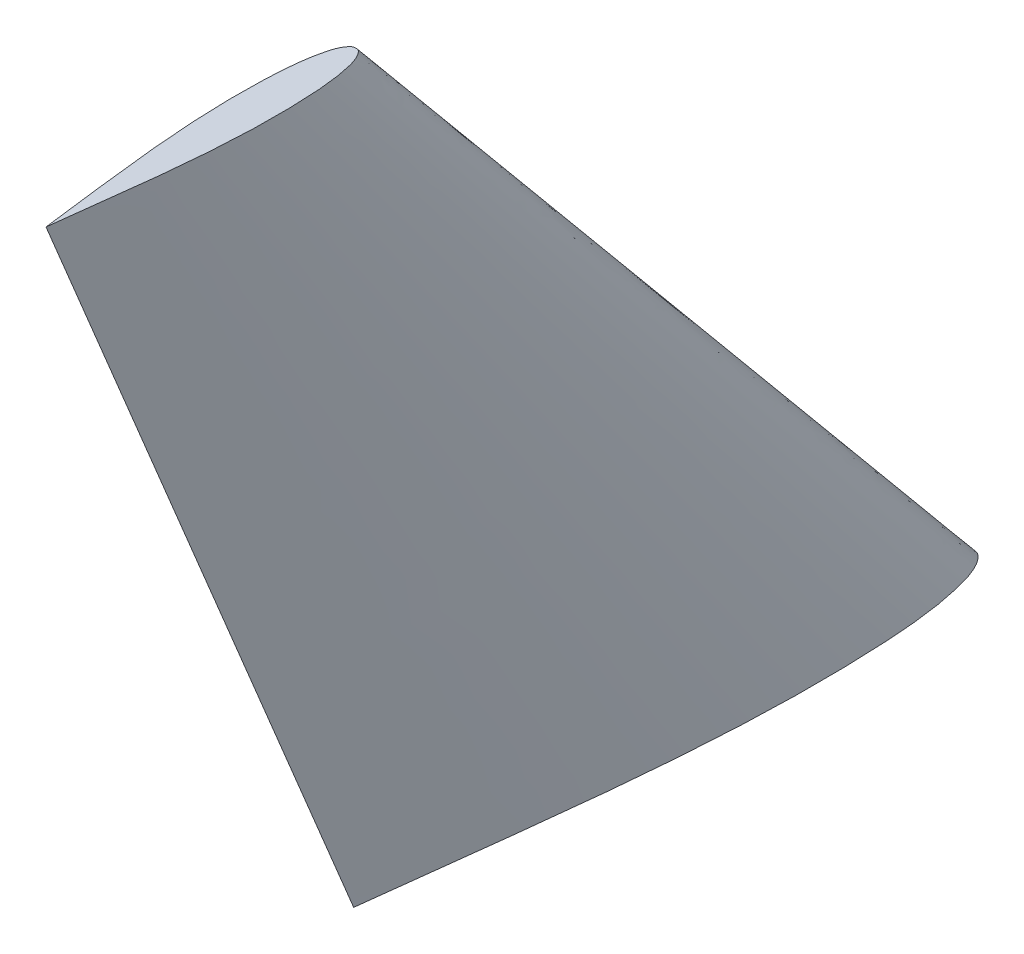
ISO-10303-21;
HEADER;
FILE_DESCRIPTION(('STEP AP214'),'2;1');
FILE_NAME('part.step','',(''),(''),'','','');
FILE_SCHEMA(('AUTOMOTIVE_DESIGN { 1 0 10303 214 1 1 1 1 }'));
ENDSEC;
DATA;
#1=APPLICATION_CONTEXT('core data for automotive mechanical design processes');
#2=APPLICATION_PROTOCOL_DEFINITION('international standard','automotive_design',2000,#1);
#3=PRODUCT_CONTEXT('',#1,'mechanical');
#4=PRODUCT('Part','Part','',(#3));
#5=PRODUCT_RELATED_PRODUCT_CATEGORY('part','',(#4));
#6=PRODUCT_DEFINITION_FORMATION('','',#4);
#7=PRODUCT_DEFINITION_CONTEXT('part definition',#1,'design');
#8=PRODUCT_DEFINITION('design','',#6,#7);
#9=PRODUCT_DEFINITION_SHAPE('','',#8);
#10=(LENGTH_UNIT() NAMED_UNIT(*) SI_UNIT(.MILLI.,.METRE.));
#11=(NAMED_UNIT(*) PLANE_ANGLE_UNIT() SI_UNIT($,.RADIAN.));
#12=(NAMED_UNIT(*) SI_UNIT($,.STERADIAN.) SOLID_ANGLE_UNIT());
#13=UNCERTAINTY_MEASURE_WITH_UNIT(LENGTH_MEASURE(1.E-05),#10,'distance_accuracy_value','');
#14=(GEOMETRIC_REPRESENTATION_CONTEXT(3) GLOBAL_UNCERTAINTY_ASSIGNED_CONTEXT((#13)) GLOBAL_UNIT_ASSIGNED_CONTEXT((#10,
#11,#12)) REPRESENTATION_CONTEXT('',''));
#15=CARTESIAN_POINT('',(0.,0.,0.));
#16=DIRECTION('',(0.,0.,1.));
#17=DIRECTION('',(1.,0.,0.));
#18=AXIS2_PLACEMENT_3D('',#15,#16,#17);
#19=CARTESIAN_POINT('',(-154.159683568684,6696.456,4147.13388304821));
#20=DIRECTION('',(0.,-1.,0.));
#21=DIRECTION('',(0.,0.,-1.));
#22=AXIS2_PLACEMENT_3D('',#19,#20,#21);
#23=PLANE('',#22);
#24=CARTESIAN_POINT('',(0.,6696.456,2772.65353731669));
#25=CARTESIAN_POINT('',(-16.9799177376313,6696.456,2767.14530322179));
#26=CARTESIAN_POINT('',(-40.191091939583,6696.456,2785.80598263826));
#27=CARTESIAN_POINT('',(-82.3452108224661,6696.456,2843.24208974967));
#28=CARTESIAN_POINT('',(-112.463446335225,6696.456,2942.34070083599));
#29=CARTESIAN_POINT('',(-146.975535405465,6696.456,3121.72352900064));
#30=CARTESIAN_POINT('',(-216.027003638885,6696.456,4000.057912964));
#31=CARTESIAN_POINT('',(-88.1786721100751,6696.456,4833.01007460194));
#32=CARTESIAN_POINT('',(0.,6696.456,5562.79517571669));
#33=B_SPLINE_CURVE_WITH_KNOTS('',3,(#24,#25,#26,#27,#28,#29,#30,#31,#32),.UNSPECIFIED.,.F.,.F.,
(4,1,1,1,1,1,4),(0.,0.0164373606134582,0.028569000403652,0.0756971622985249,0.12246031924641,
0.221963948972587,1.),.UNSPECIFIED.);
#34=CARTESIAN_POINT('',(0.,6696.456,2772.65353731669));
#35=VERTEX_POINT('',#34);
#36=CARTESIAN_POINT('',(0.,6696.456,5562.79517571669));
#37=VERTEX_POINT('',#36);
#38=EDGE_CURVE('E56',#35,#37,#33,.T.);
#39=ORIENTED_EDGE('',*,*,#38,.T.);
#40=CARTESIAN_POINT('',(0.,6696.456,5562.79517571669));
#41=CARTESIAN_POINT('',(88.1786721100753,6696.456,4833.01007460193));
#42=CARTESIAN_POINT('',(216.027003638886,6696.456,4000.057912964));
#43=CARTESIAN_POINT('',(146.975535405465,6696.456,3121.72352900064));
#44=CARTESIAN_POINT('',(112.463446335225,6696.456,2942.34070083599));
#45=CARTESIAN_POINT('',(82.345210822466,6696.456,2843.24208974967));
#46=CARTESIAN_POINT('',(40.191091939583,6696.456,2785.80598263826));
#47=CARTESIAN_POINT('',(16.9799177376313,6696.456,2767.14530322179));
#48=CARTESIAN_POINT('',(0.,6696.456,2772.65353731669));
#49=B_SPLINE_CURVE_WITH_KNOTS('',3,(#40,#41,#42,#43,#44,#45,#46,#47,#48),.UNSPECIFIED.,.F.,.F.,
(4,1,1,1,1,1,4),(0.,0.778036051027413,0.87753968075359,0.924302837701475,0.971430999596348,
0.983562639386542,1.),.UNSPECIFIED.);
#50=EDGE_CURVE('E13',#37,#35,#49,.T.);
#51=ORIENTED_EDGE('',*,*,#50,.T.);
#52=EDGE_LOOP('',(#39,#51));
#53=FACE_BOUND('',#52,.T.);
#54=ADVANCED_FACE('F47',(#53),#23,.F.);
#55=CARTESIAN_POINT('',(-304.474221344365,0.,-41.5864506878354));
#56=DIRECTION('',(0.,-1.,0.));
#57=DIRECTION('',(0.,0.,-1.));
#58=AXIS2_PLACEMENT_3D('',#55,#56,#57);
#59=PLANE('',#58);
#60=CARTESIAN_POINT('',(-1.0250816319537E-12,0.,-2790.142248));
#61=CARTESIAN_POINT('',(-32.4305536252133,0.,-2797.70395188873));
#62=CARTESIAN_POINT('',(-84.2145432485902,0.,-2759.26570691292));
#63=CARTESIAN_POINT('',(-160.784275422863,0.,-2647.85891062494));
#64=CARTESIAN_POINT('',(-216.23651145109,0.,-2472.6267179323));
#65=CARTESIAN_POINT('',(-292.945329003994,0.,-2117.62583216752));
#66=CARTESIAN_POINT('',(-431.079514036101,0.,-352.454920959716));
#67=CARTESIAN_POINT('',(-168.446184180462,0.,1327.50774931477));
#68=CARTESIAN_POINT('',(0.,0.,2790.142248));
#69=B_SPLINE_CURVE_WITH_KNOTS('',3,(#60,#61,#62,#63,#64,#65,#66,#67,#68),.UNSPECIFIED.,.F.,.F.,
(4,1,1,1,1,1,4),(0.,0.0158918859418977,0.0314091335849106,0.0714182578966169,0.111026583499901,
0.223280698620743,1.),.UNSPECIFIED.);
#70=CARTESIAN_POINT('',(-1.0250816319537E-12,0.,-2790.142248));
#71=VERTEX_POINT('',#70);
#72=CARTESIAN_POINT('',(-1.23645609139159E-13,0.,2790.142248));
#73=VERTEX_POINT('',#72);
#74=EDGE_CURVE('E78',#71,#73,#69,.T.);
#75=ORIENTED_EDGE('',*,*,#74,.F.);
#76=CARTESIAN_POINT('',(-1.23645609139159E-13,0.,2790.142248));
#77=CARTESIAN_POINT('',(168.446184180462,0.,1327.50774931477));
#78=CARTESIAN_POINT('',(431.079514036101,0.,-352.454920959716));
#79=CARTESIAN_POINT('',(292.945329003994,0.,-2117.62583216752));
#80=CARTESIAN_POINT('',(216.23651145109,0.,-2472.6267179323));
#81=CARTESIAN_POINT('',(160.784275422862,0.,-2647.85891062494));
#82=CARTESIAN_POINT('',(84.2145432485899,0.,-2759.26570691292));
#83=CARTESIAN_POINT('',(32.4305536252121,0.,-2797.70395188873));
#84=CARTESIAN_POINT('',(-1.0250816319537E-12,0.,-2790.142248));
#85=B_SPLINE_CURVE_WITH_KNOTS('',3,(#76,#77,#78,#79,#80,#81,#82,#83,#84),.UNSPECIFIED.,.F.,.F.,
(4,1,1,1,1,1,4),(0.,0.776719301379257,0.888973416500099,0.928581742103383,0.968590866415089,
0.984108114058102,1.),.UNSPECIFIED.);
#86=EDGE_CURVE('E81',#73,#71,#85,.T.);
#87=ORIENTED_EDGE('',*,*,#86,.F.);
#88=EDGE_LOOP('',(#75,#87));
#89=FACE_BOUND('',#88,.T.);
#90=ADVANCED_FACE('F85',(#89),#59,.T.);
#91=CARTESIAN_POINT('',(-1.23645609139159E-13,0.,2790.142248));
#92=CARTESIAN_POINT('',(0.,6696.456,5562.79517571669));
#93=CARTESIAN_POINT('',(168.446184180462,0.,1327.50774931477));
#94=CARTESIAN_POINT('',(88.0294383627155,6696.456,4834.24516425344));
#95=CARTESIAN_POINT('',(398.304799788501,0.,-142.807895217985));
#96=CARTESIAN_POINT('',(201.338531345484,6696.456,4095.75564011964));
#97=CARTESIAN_POINT('',(316.407308673735,0.,-1809.72984281051));
#98=CARTESIAN_POINT('',(158.000990975278,6696.456,3261.96727723046));
#99=CARTESIAN_POINT('',(300.12292952093,0.,-2023.05703865941));
#100=CARTESIAN_POINT('',(149.614874273945,6696.456,3155.29590824797));
#101=CARTESIAN_POINT('',(253.987738775784,0.,-2296.1739669418));
#102=CARTESIAN_POINT('',(127.178326291462,6696.456,3018.82395217673));
#103=CARTESIAN_POINT('',(233.942534298904,0.,-2390.68498039983));
#104=CARTESIAN_POINT('',(117.413173403406,6696.456,2971.43565942827));
#105=CARTESIAN_POINT('',(195.643652552212,0.,-2537.7013132439));
#106=CARTESIAN_POINT('',(98.6336928278236,6696.456,2897.27757611114));
#107=CARTESIAN_POINT('',(168.173528359326,0.,-2624.50845468015));
#108=CARTESIAN_POINT('',(84.5103706403039,6696.456,2853.79920180606));
#109=CARTESIAN_POINT('',(115.368146803783,0.,-2713.81432239034));
#110=CARTESIAN_POINT('',(57.6821617623218,6696.456,2809.63803005035));
#111=CARTESIAN_POINT('',(98.0120020833552,0.,-2737.6000624638));
#112=CARTESIAN_POINT('',(49.040940849719,6696.456,2797.86413693949));
#113=CARTESIAN_POINT('',(59.5306998021813,0.,-2777.58804221845));
#114=CARTESIAN_POINT('',(29.8914416895785,6696.456,2777.52555400742));
#115=CARTESIAN_POINT('',(32.4305536252121,0.,-2797.70395188873));
#116=CARTESIAN_POINT('',(16.416438279532,6696.456,2767.32809425828));
#117=CARTESIAN_POINT('',(-1.0250816319537E-12,0.,-2790.142248));
#118=CARTESIAN_POINT('',(0.,6696.456,2772.65353731669));
#119=B_SPLINE_SURFACE_WITH_KNOTS('',3,1,((#91,#92),(#93,#94),(#95,#96),(#97,#98),(#99,#100),
(#101,#102),(#103,#104),(#105,#106),(#107,#108),(#109,#110),(#111,#112),(#113,#114),(#115,#116),
(#117,#118)),.UNSPECIFIED.,.F.,.F.,.F.,(4,1,1,1,1,1,1,1,1,1,1,4),(2,2),(0.,0.776719301379257,
0.778036051027413,0.87753968075359,0.888973416500099,0.924302837701475,0.928581742103383,
0.968590866415089,0.971430999596348,0.983562639386542,0.984108114058102,1.),(0.,1.),.UNSPECIFIED.);
#120=DIRECTION('',(0.,0.769213737010922,0.638991570205502));
#121=VECTOR('',#120,1.);
#122=CARTESIAN_POINT('',(-5.1254081597685E-13,3348.228,-8.7443553416553));
#123=LINE('',#122,#121);
#124=EDGE_CURVE('E74',#71,#35,#123,.T.);
#125=DIRECTION('',(0.,-0.923933668589573,-0.38255271015458));
#126=VECTOR('',#125,1.);
#127=CARTESIAN_POINT('',(0.,3348.228,4176.46871185834));
#128=LINE('',#127,#126);
#129=EDGE_CURVE('E63',#37,#73,#128,.T.);
#130=ORIENTED_EDGE('',*,*,#86,.T.);
#131=ORIENTED_EDGE('',*,*,#124,.T.);
#132=ORIENTED_EDGE('',*,*,#50,.F.);
#133=ORIENTED_EDGE('',*,*,#129,.T.);
#134=EDGE_LOOP('',(#130,#131,#132,#133));
#135=FACE_BOUND('',#134,.T.);
#136=ADVANCED_FACE('F82',(#135),#119,.T.);
#137=CARTESIAN_POINT('',(-1.0250816319537E-12,0.,-2790.142248));
#138=CARTESIAN_POINT('',(0.,6696.456,2772.65353731669));
#139=CARTESIAN_POINT('',(-32.4305536252133,0.,-2797.70395188873));
#140=CARTESIAN_POINT('',(-16.4164382795316,6696.456,2767.32809425828));
#141=CARTESIAN_POINT('',(-59.5306998021824,0.,-2777.58804221845));
#142=CARTESIAN_POINT('',(-29.8914416895782,6696.456,2777.52555400742));
#143=CARTESIAN_POINT('',(-98.012002083356,0.,-2737.6000624638));
#144=CARTESIAN_POINT('',(-49.0409408497188,6696.456,2797.86413693949));
#145=CARTESIAN_POINT('',(-115.368146803784,0.,-2713.81432239034));
#146=CARTESIAN_POINT('',(-57.6821617623216,6696.456,2809.63803005035));
#147=CARTESIAN_POINT('',(-168.173528359326,0.,-2624.50845468015));
#148=CARTESIAN_POINT('',(-84.5103706403036,6696.456,2853.79920180606));
#149=CARTESIAN_POINT('',(-195.643652552212,0.,-2537.7013132439));
#150=CARTESIAN_POINT('',(-98.6336928278234,6696.456,2897.27757611114));
#151=CARTESIAN_POINT('',(-233.942534298904,0.,-2390.68498039983));
#152=CARTESIAN_POINT('',(-117.413173403405,6696.456,2971.43565942827));
#153=CARTESIAN_POINT('',(-253.987738775784,0.,-2296.1739669418));
#154=CARTESIAN_POINT('',(-127.178326291462,6696.456,3018.82395217673));
#155=CARTESIAN_POINT('',(-300.12292952093,0.,-2023.05703865941));
#156=CARTESIAN_POINT('',(-149.614874273945,6696.456,3155.29590824797));
#157=CARTESIAN_POINT('',(-316.407308673735,0.,-1809.72984281051));
#158=CARTESIAN_POINT('',(-158.000990975278,6696.456,3261.96727723046));
#159=CARTESIAN_POINT('',(-398.304799788501,0.,-142.807895217985));
#160=CARTESIAN_POINT('',(-201.338531345483,6696.456,4095.75564011964));
#161=CARTESIAN_POINT('',(-168.446184180462,0.,1327.50774931477));
#162=CARTESIAN_POINT('',(-88.0294383627154,6696.456,4834.24516425345));
#163=CARTESIAN_POINT('',(0.,0.,2790.142248));
#164=CARTESIAN_POINT('',(0.,6696.456,5562.79517571669));
#165=B_SPLINE_SURFACE_WITH_KNOTS('',3,1,((#137,#138),(#139,#140),(#141,#142),(#143,#144),(#145,
#146),(#147,#148),(#149,#150),(#151,#152),(#153,#154),(#155,#156),(#157,#158),(#159,#160),(#161,
#162),(#163,#164)),.UNSPECIFIED.,.F.,.F.,.F.,(4,1,1,1,1,1,1,1,1,1,1,4),(2,2),(0.,
0.0158918859418977,0.0164373606134582,0.028569000403652,0.0314091335849106,0.0714182578966169,
0.0756971622985249,0.111026583499901,0.12246031924641,0.221963948972587,0.223280698620743,1.),
(0.,1.),.UNSPECIFIED.);
#166=ORIENTED_EDGE('',*,*,#74,.T.);
#167=ORIENTED_EDGE('',*,*,#129,.F.);
#168=ORIENTED_EDGE('',*,*,#38,.F.);
#169=ORIENTED_EDGE('',*,*,#124,.F.);
#170=EDGE_LOOP('',(#166,#167,#168,#169));
#171=FACE_BOUND('',#170,.T.);
#172=ADVANCED_FACE('F76',(#171),#165,.T.);
#173=CLOSED_SHELL('',(#54,#90,#136,#172));
#174=MANIFOLD_SOLID_BREP('B2',#173);
#175=ADVANCED_BREP_SHAPE_REPRESENTATION('',(#18,#174),#14);
#176=SHAPE_DEFINITION_REPRESENTATION(#9,#175);
ENDSEC;
END-ISO-10303-21;
